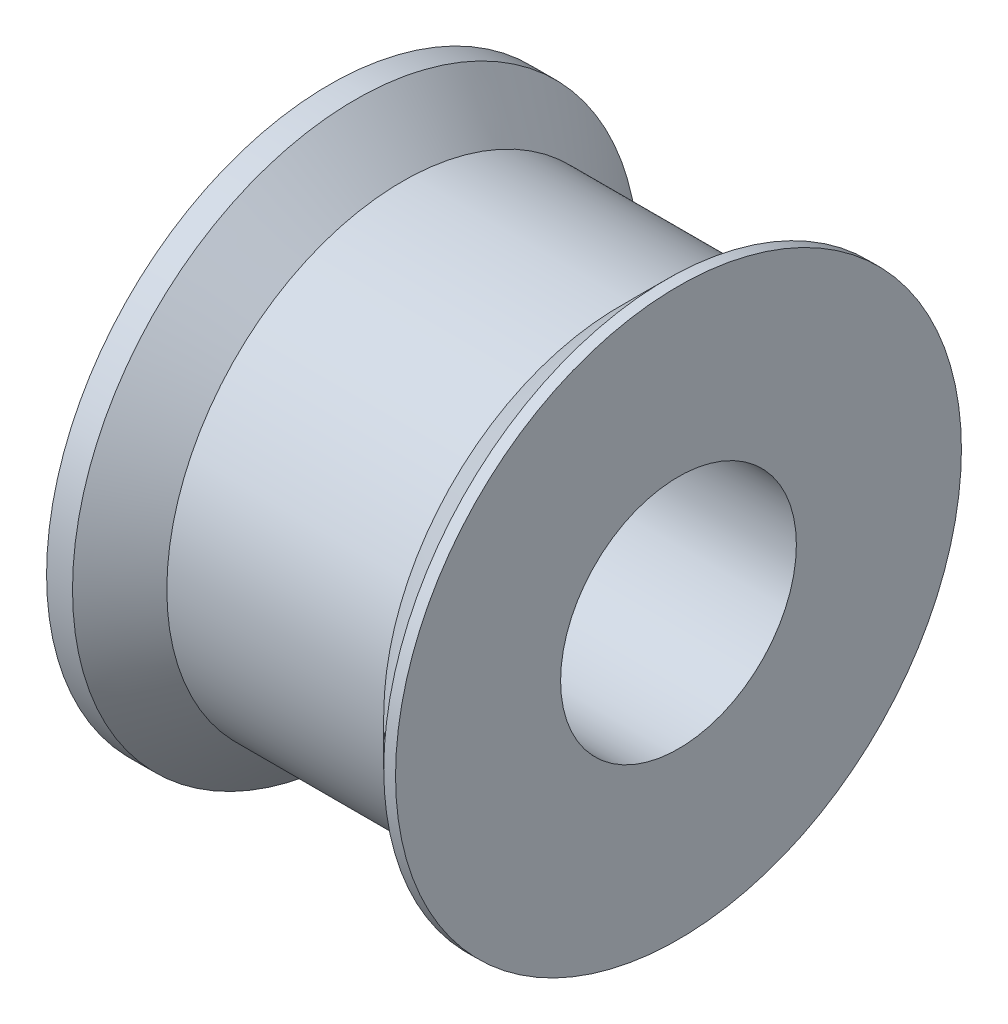
ISO-10303-21;
HEADER;
FILE_DESCRIPTION(('STEP AP214'),'2;1');
FILE_NAME('part.step','',(''),(''),'','','');
FILE_SCHEMA(('AUTOMOTIVE_DESIGN { 1 0 10303 214 1 1 1 1 }'));
ENDSEC;
DATA;
#1=APPLICATION_CONTEXT('core data for automotive mechanical design processes');
#2=APPLICATION_PROTOCOL_DEFINITION('international standard','automotive_design',2000,#1);
#3=PRODUCT_CONTEXT('',#1,'mechanical');
#4=PRODUCT('Part','Part','',(#3));
#5=PRODUCT_RELATED_PRODUCT_CATEGORY('part','',(#4));
#6=PRODUCT_DEFINITION_FORMATION('','',#4);
#7=PRODUCT_DEFINITION_CONTEXT('part definition',#1,'design');
#8=PRODUCT_DEFINITION('design','',#6,#7);
#9=PRODUCT_DEFINITION_SHAPE('','',#8);
#10=(LENGTH_UNIT() NAMED_UNIT(*) SI_UNIT(.MILLI.,.METRE.));
#11=(NAMED_UNIT(*) PLANE_ANGLE_UNIT() SI_UNIT($,.RADIAN.));
#12=(NAMED_UNIT(*) SI_UNIT($,.STERADIAN.) SOLID_ANGLE_UNIT());
#13=UNCERTAINTY_MEASURE_WITH_UNIT(LENGTH_MEASURE(1.E-05),#10,'distance_accuracy_value','');
#14=(GEOMETRIC_REPRESENTATION_CONTEXT(3) GLOBAL_UNCERTAINTY_ASSIGNED_CONTEXT((#13)) GLOBAL_UNIT_ASSIGNED_CONTEXT((#10,
#11,#12)) REPRESENTATION_CONTEXT('',''));
#15=CARTESIAN_POINT('',(0.,0.,0.));
#16=DIRECTION('',(0.,0.,1.));
#17=DIRECTION('',(1.,0.,0.));
#18=AXIS2_PLACEMENT_3D('',#15,#16,#17);
#19=CARTESIAN_POINT('',(-7.7,0.,0.));
#20=DIRECTION('',(-1.,0.,0.));
#21=DIRECTION('',(0.,0.,1.));
#22=AXIS2_PLACEMENT_3D('',#19,#20,#21);
#23=PLANE('',#22);
#24=CARTESIAN_POINT('',(-7.7,0.,0.));
#25=DIRECTION('',(-1.,0.,0.));
#26=DIRECTION('',(0.,0.,1.));
#27=AXIS2_PLACEMENT_3D('',#24,#25,#26);
#28=CIRCLE('',#27,3.1);
#29=CARTESIAN_POINT('',(-7.7,0.,3.1));
#30=VERTEX_POINT('',#29);
#31=EDGE_CURVE('E58',#30,#30,#28,.T.);
#32=ORIENTED_EDGE('',*,*,#31,.F.);
#33=EDGE_LOOP('',(#32));
#34=FACE_BOUND('',#33,.T.);
#35=CARTESIAN_POINT('',(-7.7,0.,0.));
#36=DIRECTION('',(1.,0.,0.));
#37=DIRECTION('',(0.,0.,-1.));
#38=AXIS2_PLACEMENT_3D('',#35,#36,#37);
#39=CIRCLE('',#38,12.);
#40=CARTESIAN_POINT('',(-7.7,0.,-12.));
#41=VERTEX_POINT('',#40);
#42=EDGE_CURVE('E10',#41,#41,#39,.T.);
#43=ORIENTED_EDGE('',*,*,#42,.F.);
#44=EDGE_LOOP('',(#43));
#45=FACE_BOUND('',#44,.T.);
#46=ADVANCED_FACE('F33',(#34,#45),#23,.T.);
#47=CARTESIAN_POINT('',(7.1,0.,0.));
#48=DIRECTION('',(1.,0.,0.));
#49=DIRECTION('',(0.,0.,-1.));
#50=AXIS2_PLACEMENT_3D('',#47,#48,#49);
#51=CYLINDRICAL_SURFACE('',#50,12.);
#52=CARTESIAN_POINT('',(-6.60000000000001,0.,0.));
#53=DIRECTION('',(1.,0.,0.));
#54=DIRECTION('',(0.,0.,-1.));
#55=AXIS2_PLACEMENT_3D('',#52,#53,#54);
#56=CIRCLE('',#55,12.);
#57=CARTESIAN_POINT('',(-6.60000000000001,0.,-12.));
#58=VERTEX_POINT('',#57);
#59=EDGE_CURVE('E40',#58,#58,#56,.T.);
#60=ORIENTED_EDGE('',*,*,#59,.F.);
#61=EDGE_LOOP('',(#60));
#62=FACE_BOUND('',#61,.T.);
#63=ORIENTED_EDGE('',*,*,#42,.T.);
#64=EDGE_LOOP('',(#63));
#65=FACE_BOUND('',#64,.T.);
#66=ADVANCED_FACE('F86',(#62,#65),#51,.T.);
#67=CARTESIAN_POINT('',(-6.60000000000001,0.,0.));
#68=DIRECTION('',(-1.,0.,0.));
#69=DIRECTION('',(0.,0.,1.));
#70=AXIS2_PLACEMENT_3D('',#67,#68,#69);
#71=CONICAL_SURFACE('',#70,12.,0.785398163397445);
#72=CARTESIAN_POINT('',(-4.6,0.,0.));
#73=DIRECTION('',(1.,0.,0.));
#74=DIRECTION('',(0.,0.,-1.));
#75=AXIS2_PLACEMENT_3D('',#72,#73,#74);
#76=CIRCLE('',#75,9.99999999999999);
#77=CARTESIAN_POINT('',(-4.6,0.,-9.99999999999999));
#78=VERTEX_POINT('',#77);
#79=EDGE_CURVE('E44',#78,#78,#76,.T.);
#80=ORIENTED_EDGE('',*,*,#79,.F.);
#81=EDGE_LOOP('',(#80));
#82=FACE_BOUND('',#81,.T.);
#83=ORIENTED_EDGE('',*,*,#59,.T.);
#84=EDGE_LOOP('',(#83));
#85=FACE_BOUND('',#84,.T.);
#86=ADVANCED_FACE('F90',(#82,#85),#71,.T.);
#87=CARTESIAN_POINT('',(7.1,0.,0.));
#88=DIRECTION('',(1.,0.,0.));
#89=DIRECTION('',(0.,0.,-1.));
#90=AXIS2_PLACEMENT_3D('',#87,#88,#89);
#91=CYLINDRICAL_SURFACE('',#90,9.99999999999997);
#92=CARTESIAN_POINT('',(4.6,0.,0.));
#93=DIRECTION('',(1.,0.,0.));
#94=DIRECTION('',(0.,0.,-1.));
#95=AXIS2_PLACEMENT_3D('',#92,#93,#94);
#96=CIRCLE('',#95,9.99999999999994);
#97=CARTESIAN_POINT('',(4.6,0.,-9.99999999999994));
#98=VERTEX_POINT('',#97);
#99=EDGE_CURVE('E49',#98,#98,#96,.T.);
#100=ORIENTED_EDGE('',*,*,#99,.F.);
#101=EDGE_LOOP('',(#100));
#102=FACE_BOUND('',#101,.T.);
#103=ORIENTED_EDGE('',*,*,#79,.T.);
#104=EDGE_LOOP('',(#103));
#105=FACE_BOUND('',#104,.T.);
#106=ADVANCED_FACE('F95',(#102,#105),#91,.T.);
#107=CARTESIAN_POINT('',(4.6,0.,0.));
#108=DIRECTION('',(1.,0.,0.));
#109=DIRECTION('',(0.,0.,-1.));
#110=AXIS2_PLACEMENT_3D('',#107,#108,#109);
#111=CONICAL_SURFACE('',#110,9.99999999999994,0.785398163397458);
#112=CARTESIAN_POINT('',(6.60000000000001,0.,0.));
#113=DIRECTION('',(1.,0.,0.));
#114=DIRECTION('',(0.,0.,-1.));
#115=AXIS2_PLACEMENT_3D('',#112,#113,#114);
#116=CIRCLE('',#115,12.);
#117=CARTESIAN_POINT('',(6.60000000000001,0.,-12.));
#118=VERTEX_POINT('',#117);
#119=EDGE_CURVE('E52',#118,#118,#116,.T.);
#120=ORIENTED_EDGE('',*,*,#119,.F.);
#121=EDGE_LOOP('',(#120));
#122=FACE_BOUND('',#121,.T.);
#123=ORIENTED_EDGE('',*,*,#99,.T.);
#124=EDGE_LOOP('',(#123));
#125=FACE_BOUND('',#124,.T.);
#126=ADVANCED_FACE('F102',(#122,#125),#111,.T.);
#127=CARTESIAN_POINT('',(7.1,0.,0.));
#128=DIRECTION('',(1.,0.,0.));
#129=DIRECTION('',(0.,0.,-1.));
#130=AXIS2_PLACEMENT_3D('',#127,#128,#129);
#131=CYLINDRICAL_SURFACE('',#130,12.);
#132=CARTESIAN_POINT('',(7.10000000000001,0.,0.));
#133=DIRECTION('',(1.,0.,0.));
#134=DIRECTION('',(0.,0.,-1.));
#135=AXIS2_PLACEMENT_3D('',#132,#133,#134);
#136=CIRCLE('',#135,12.);
#137=CARTESIAN_POINT('',(7.10000000000001,0.,-12.));
#138=VERTEX_POINT('',#137);
#139=EDGE_CURVE('E55',#138,#138,#136,.T.);
#140=ORIENTED_EDGE('',*,*,#139,.F.);
#141=EDGE_LOOP('',(#140));
#142=FACE_BOUND('',#141,.T.);
#143=ORIENTED_EDGE('',*,*,#119,.T.);
#144=EDGE_LOOP('',(#143));
#145=FACE_BOUND('',#144,.T.);
#146=ADVANCED_FACE('F106',(#142,#145),#131,.T.);
#147=CARTESIAN_POINT('',(7.1,0.,0.));
#148=DIRECTION('',(-1.,0.,0.));
#149=DIRECTION('',(0.,0.,1.));
#150=AXIS2_PLACEMENT_3D('',#147,#148,#149);
#151=PLANE('',#150);
#152=CARTESIAN_POINT('',(7.1,-2.98372437868011E-13,6.45317133063372E-13));
#153=DIRECTION('',(-1.,0.,0.));
#154=DIRECTION('',(0.,0.,1.));
#155=AXIS2_PLACEMENT_3D('',#152,#153,#154);
#156=CIRCLE('',#155,5.00000000000003);
#157=CARTESIAN_POINT('',(7.1,-2.98372437868011E-13,5.00000000000067));
#158=VERTEX_POINT('',#157);
#159=EDGE_CURVE('E61',#158,#158,#156,.F.);
#160=ORIENTED_EDGE('',*,*,#159,.F.);
#161=EDGE_LOOP('',(#160));
#162=FACE_BOUND('',#161,.T.);
#163=ORIENTED_EDGE('',*,*,#139,.T.);
#164=EDGE_LOOP('',(#163));
#165=FACE_BOUND('',#164,.T.);
#166=ADVANCED_FACE('F80',(#162,#165),#151,.F.);
#167=CARTESIAN_POINT('',(15.8681240867132,0.,0.));
#168=DIRECTION('',(-1.,0.,0.));
#169=DIRECTION('',(0.,0.,1.));
#170=AXIS2_PLACEMENT_3D('',#167,#168,#169);
#171=CYLINDRICAL_SURFACE('',#170,3.1);
#172=CARTESIAN_POINT('',(-5.7,0.,0.));
#173=DIRECTION('',(-1.,0.,0.));
#174=DIRECTION('',(0.,0.,1.));
#175=AXIS2_PLACEMENT_3D('',#172,#173,#174);
#176=CIRCLE('',#175,3.1);
#177=CARTESIAN_POINT('',(-5.7,0.,3.1));
#178=VERTEX_POINT('',#177);
#179=EDGE_CURVE('E36',#178,#178,#176,.F.);
#180=ORIENTED_EDGE('',*,*,#179,.T.);
#181=EDGE_LOOP('',(#180));
#182=FACE_BOUND('',#181,.T.);
#183=ORIENTED_EDGE('',*,*,#31,.T.);
#184=EDGE_LOOP('',(#183));
#185=FACE_BOUND('',#184,.T.);
#186=ADVANCED_FACE('F73',(#182,#185),#171,.F.);
#187=CARTESIAN_POINT('',(-5.7,-2.98372437868011E-13,6.45317133063372E-13));
#188=DIRECTION('',(-1.,0.,0.));
#189=DIRECTION('',(0.,0.,1.));
#190=AXIS2_PLACEMENT_3D('',#187,#188,#189);
#191=PLANE('',#190);
#192=CARTESIAN_POINT('',(-5.7,-2.98372437868011E-13,6.45317133063372E-13));
#193=DIRECTION('',(-1.,0.,0.));
#194=DIRECTION('',(0.,0.,1.));
#195=AXIS2_PLACEMENT_3D('',#192,#193,#194);
#196=CIRCLE('',#195,5.00000000000003);
#197=CARTESIAN_POINT('',(-5.7,-2.98372437868011E-13,5.00000000000067));
#198=VERTEX_POINT('',#197);
#199=EDGE_CURVE('E64',#198,#198,#196,.T.);
#200=ORIENTED_EDGE('',*,*,#199,.F.);
#201=EDGE_LOOP('',(#200));
#202=FACE_BOUND('',#201,.T.);
#203=ORIENTED_EDGE('',*,*,#179,.F.);
#204=EDGE_LOOP('',(#203));
#205=FACE_BOUND('',#204,.T.);
#206=ADVANCED_FACE('F70',(#202,#205),#191,.F.);
#207=CARTESIAN_POINT('',(21.242135623731,-2.98372437868011E-13,6.45317133063372E-13));
#208=DIRECTION('',(-1.,0.,0.));
#209=DIRECTION('',(0.,0.,1.));
#210=AXIS2_PLACEMENT_3D('',#207,#208,#209);
#211=CYLINDRICAL_SURFACE('',#210,5.00000000000003);
#212=CARTESIAN_POINT('',(7.1,-2.98372437868011E-13,5.00000000000067));
#213=CARTESIAN_POINT('',(6.96666666666667,-2.98372437868011E-13,5.00000000000067));
#214=CARTESIAN_POINT('',(6.83333333333334,-2.98372437868011E-13,5.00000000000067));
#215=CARTESIAN_POINT('',(6.56666666666667,-2.98372437868011E-13,5.00000000000067));
#216=CARTESIAN_POINT('',(6.43333333333334,-2.98372437868011E-13,5.00000000000067));
#217=CARTESIAN_POINT('',(6.16666666666667,-2.98372437868011E-13,5.00000000000067));
#218=CARTESIAN_POINT('',(6.03333333333334,-2.98372437868011E-13,5.00000000000067));
#219=CARTESIAN_POINT('',(5.76666666666667,-2.98372437868011E-13,5.00000000000067));
#220=CARTESIAN_POINT('',(5.63333333333334,-2.98372437868011E-13,5.00000000000067));
#221=CARTESIAN_POINT('',(5.36666666666667,-2.98372437868011E-13,5.00000000000067));
#222=CARTESIAN_POINT('',(5.23333333333334,-2.98372437868011E-13,5.00000000000067));
#223=CARTESIAN_POINT('',(4.96666666666667,-2.98372437868011E-13,5.00000000000067));
#224=CARTESIAN_POINT('',(4.83333333333334,-2.98372437868011E-13,5.00000000000067));
#225=CARTESIAN_POINT('',(4.56666666666667,-2.98372437868011E-13,5.00000000000067));
#226=CARTESIAN_POINT('',(4.43333333333334,-2.98372437868011E-13,5.00000000000067));
#227=CARTESIAN_POINT('',(4.16666666666667,-2.98372437868011E-13,5.00000000000067));
#228=CARTESIAN_POINT('',(4.03333333333334,-2.98372437868011E-13,5.00000000000067));
#229=CARTESIAN_POINT('',(3.76666666666667,-2.98372437868011E-13,5.00000000000067));
#230=CARTESIAN_POINT('',(3.63333333333334,-2.98372437868011E-13,5.00000000000067));
#231=CARTESIAN_POINT('',(3.36666666666667,-2.98372437868011E-13,5.00000000000067));
#232=CARTESIAN_POINT('',(3.23333333333334,-2.98372437868011E-13,5.00000000000067));
#233=CARTESIAN_POINT('',(2.96666666666667,-2.98372437868011E-13,5.00000000000067));
#234=CARTESIAN_POINT('',(2.83333333333334,-2.98372437868011E-13,5.00000000000067));
#235=CARTESIAN_POINT('',(2.56666666666667,-2.98372437868011E-13,5.00000000000067));
#236=CARTESIAN_POINT('',(2.43333333333334,-2.98372437868011E-13,5.00000000000067));
#237=CARTESIAN_POINT('',(2.16666666666667,-2.98372437868011E-13,5.00000000000067));
#238=CARTESIAN_POINT('',(2.03333333333334,-2.98372437868011E-13,5.00000000000067));
#239=CARTESIAN_POINT('',(1.76666666666667,-2.98372437868011E-13,5.00000000000067));
#240=CARTESIAN_POINT('',(1.63333333333334,-2.98372437868011E-13,5.00000000000067));
#241=CARTESIAN_POINT('',(1.36666666666667,-2.98372437868011E-13,5.00000000000067));
#242=CARTESIAN_POINT('',(1.23333333333334,-2.98372437868011E-13,5.00000000000067));
#243=CARTESIAN_POINT('',(0.966666666666671,-2.98372437868011E-13,5.00000000000067));
#244=CARTESIAN_POINT('',(0.833333333333339,-2.98372437868011E-13,5.00000000000067));
#245=CARTESIAN_POINT('',(0.566666666666672,-2.98372437868011E-13,5.00000000000067));
#246=CARTESIAN_POINT('',(0.433333333333339,-2.98372437868011E-13,5.00000000000067));
#247=CARTESIAN_POINT('',(0.166666666666671,-2.98372437868011E-13,5.00000000000067));
#248=CARTESIAN_POINT('',(0.0333333333333377,-2.98372437868011E-13,5.00000000000067));
#249=CARTESIAN_POINT('',(-0.23333333333333,-2.98372437868011E-13,5.00000000000067));
#250=CARTESIAN_POINT('',(-0.366666666666663,-2.98372437868011E-13,5.00000000000067));
#251=CARTESIAN_POINT('',(-0.633333333333331,-2.98372437868011E-13,5.00000000000067));
#252=CARTESIAN_POINT('',(-0.766666666666664,-2.98372437868011E-13,5.00000000000067));
#253=CARTESIAN_POINT('',(-1.03333333333333,-2.98372437868011E-13,5.00000000000067));
#254=CARTESIAN_POINT('',(-1.16666666666666,-2.98372437868011E-13,5.00000000000067));
#255=CARTESIAN_POINT('',(-1.43333333333333,-2.98372437868011E-13,5.00000000000067));
#256=CARTESIAN_POINT('',(-1.56666666666666,-2.98372437868011E-13,5.00000000000067));
#257=CARTESIAN_POINT('',(-1.83333333333333,-2.98372437868011E-13,5.00000000000067));
#258=CARTESIAN_POINT('',(-1.96666666666666,-2.98372437868011E-13,5.00000000000067));
#259=CARTESIAN_POINT('',(-2.23333333333333,-2.98372437868011E-13,5.00000000000067));
#260=CARTESIAN_POINT('',(-2.36666666666666,-2.98372437868011E-13,5.00000000000067));
#261=CARTESIAN_POINT('',(-2.63333333333333,-2.98372437868011E-13,5.00000000000067));
#262=CARTESIAN_POINT('',(-2.76666666666666,-2.98372437868011E-13,5.00000000000067));
#263=CARTESIAN_POINT('',(-3.03333333333333,-2.98372437868011E-13,5.00000000000067));
#264=CARTESIAN_POINT('',(-3.16666666666666,-2.98372437868011E-13,5.00000000000067));
#265=CARTESIAN_POINT('',(-3.43333333333333,-2.98372437868011E-13,5.00000000000067));
#266=CARTESIAN_POINT('',(-3.56666666666666,-2.98372437868011E-13,5.00000000000067));
#267=CARTESIAN_POINT('',(-3.83333333333333,-2.98372437868011E-13,5.00000000000067));
#268=CARTESIAN_POINT('',(-3.96666666666666,-2.98372437868011E-13,5.00000000000067));
#269=CARTESIAN_POINT('',(-4.23333333333333,-2.98372437868011E-13,5.00000000000067));
#270=CARTESIAN_POINT('',(-4.36666666666666,-2.98372437868011E-13,5.00000000000067));
#271=CARTESIAN_POINT('',(-4.63333333333333,-2.98372437868011E-13,5.00000000000067));
#272=CARTESIAN_POINT('',(-4.76666666666666,-2.98372437868011E-13,5.00000000000067));
#273=CARTESIAN_POINT('',(-5.03333333333333,-2.98372437868011E-13,5.00000000000067));
#274=CARTESIAN_POINT('',(-5.16666666666666,-2.98372437868011E-13,5.00000000000067));
#275=CARTESIAN_POINT('',(-5.43333333333333,-2.98372437868011E-13,5.00000000000067));
#276=CARTESIAN_POINT('',(-5.56666666666666,-2.98372437868011E-13,5.00000000000067));
#277=CARTESIAN_POINT('',(-5.7,-2.98372437868011E-13,5.00000000000067));
#278=B_SPLINE_CURVE_WITH_KNOTS('',3,(#212,#213,#214,#215,#216,#217,#218,#219,#220,#221,#222,
#223,#224,#225,#226,#227,#228,#229,#230,#231,#232,#233,#234,#235,#236,#237,#238,#239,#240,#241,
#242,#243,#244,#245,#246,#247,#248,#249,#250,#251,#252,#253,#254,#255,#256,#257,#258,#259,#260,
#261,#262,#263,#264,#265,#266,#267,#268,#269,#270,#271,#272,#273,#274,#275,#276,#277),
.UNSPECIFIED.,.F.,.F.,(4,2,2,2,2,2,2,2,2,2,2,2,2,2,2,2,2,2,2,2,2,2,2,2,2,2,2,2,2,2,2,2,4),(0.,
0.399999999999999,0.8,1.2,1.6,2.,2.4,2.8,3.2,3.6,4.,4.4,4.8,5.2,5.6,6.,6.4,6.8,7.2,7.6,8.,8.4,
8.8,9.2,9.6,10.,10.4,10.8,11.2,11.6,12.,12.4,12.8),.UNSPECIFIED.);
#279=EDGE_CURVE('BSEAM68',#158,#198,#278,.T.);
#280=ORIENTED_EDGE('',*,*,#159,.T.);
#281=ORIENTED_EDGE('',*,*,#199,.T.);
#282=ORIENTED_EDGE('',*,*,#279,.T.);
#283=ORIENTED_EDGE('',*,*,#279,.F.);
#284=EDGE_LOOP('',(#280,#282,#281,#283));
#285=FACE_BOUND('',#284,.T.);
#286=ADVANCED_FACE('F68',(#285),#211,.F.);
#287=CLOSED_SHELL('',(#46,#66,#86,#106,#126,#146,#166,#186,#206,#286));
#288=MANIFOLD_SOLID_BREP('B2',#287);
#289=ADVANCED_BREP_SHAPE_REPRESENTATION('',(#18,#288),#14);
#290=SHAPE_DEFINITION_REPRESENTATION(#9,#289);
ENDSEC;
END-ISO-10303-21;
